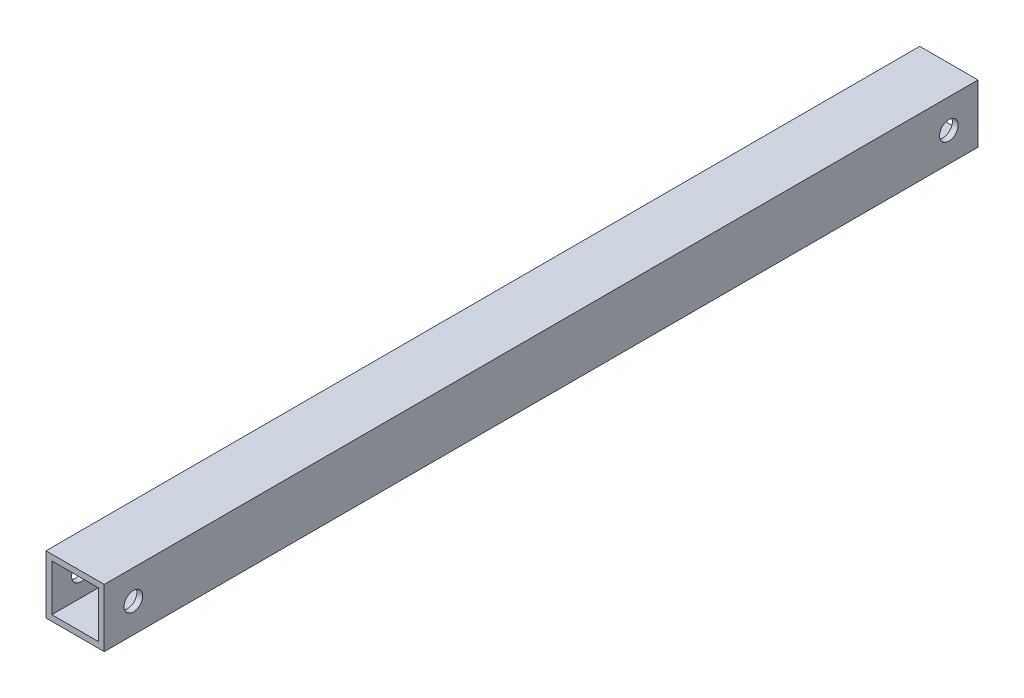
ISO-10303-21;
HEADER;
FILE_DESCRIPTION(('STEP AP214'),'2;1');
FILE_NAME('part.step','',(''),(''),'','','');
FILE_SCHEMA(('AUTOMOTIVE_DESIGN { 1 0 10303 214 1 1 1 1 }'));
ENDSEC;
DATA;
#1=APPLICATION_CONTEXT('core data for automotive mechanical design processes');
#2=APPLICATION_PROTOCOL_DEFINITION('international standard','automotive_design',2000,#1);
#3=PRODUCT_CONTEXT('',#1,'mechanical');
#4=PRODUCT('Part','Part','',(#3));
#5=PRODUCT_RELATED_PRODUCT_CATEGORY('part','',(#4));
#6=PRODUCT_DEFINITION_FORMATION('','',#4);
#7=PRODUCT_DEFINITION_CONTEXT('part definition',#1,'design');
#8=PRODUCT_DEFINITION('design','',#6,#7);
#9=PRODUCT_DEFINITION_SHAPE('','',#8);
#10=(LENGTH_UNIT() NAMED_UNIT(*) SI_UNIT(.MILLI.,.METRE.));
#11=(NAMED_UNIT(*) PLANE_ANGLE_UNIT() SI_UNIT($,.RADIAN.));
#12=(NAMED_UNIT(*) SI_UNIT($,.STERADIAN.) SOLID_ANGLE_UNIT());
#13=UNCERTAINTY_MEASURE_WITH_UNIT(LENGTH_MEASURE(1.E-05),#10,'distance_accuracy_value','');
#14=(GEOMETRIC_REPRESENTATION_CONTEXT(3) GLOBAL_UNCERTAINTY_ASSIGNED_CONTEXT((#13)) GLOBAL_UNIT_ASSIGNED_CONTEXT((#10,
#11,#12)) REPRESENTATION_CONTEXT('',''));
#15=CARTESIAN_POINT('',(0.,0.,0.));
#16=DIRECTION('',(0.,0.,1.));
#17=DIRECTION('',(1.,0.,0.));
#18=AXIS2_PLACEMENT_3D('',#15,#16,#17);
#19=CARTESIAN_POINT('',(0.,0.,150.));
#20=DIRECTION('',(0.,0.,1.));
#21=DIRECTION('',(1.,0.,0.));
#22=AXIS2_PLACEMENT_3D('',#19,#20,#21);
#23=PLANE('',#22);
#24=DIRECTION('',(0.,1.,0.));
#25=VECTOR('',#24,1.);
#26=CARTESIAN_POINT('',(5.,5.,150.));
#27=LINE('',#26,#25);
#28=CARTESIAN_POINT('',(5.,-5.,150.));
#29=VERTEX_POINT('',#28);
#30=CARTESIAN_POINT('',(5.,5.,150.));
#31=VERTEX_POINT('',#30);
#32=EDGE_CURVE('E140',#29,#31,#27,.T.);
#33=ORIENTED_EDGE('',*,*,#32,.T.);
#34=DIRECTION('',(-1.,0.,0.));
#35=VECTOR('',#34,1.);
#36=CARTESIAN_POINT('',(-5.,5.,150.));
#37=LINE('',#36,#35);
#38=CARTESIAN_POINT('',(-5.,5.,150.));
#39=VERTEX_POINT('',#38);
#40=EDGE_CURVE('E143',#31,#39,#37,.T.);
#41=ORIENTED_EDGE('',*,*,#40,.T.);
#42=DIRECTION('',(0.,-1.,0.));
#43=VECTOR('',#42,1.);
#44=CARTESIAN_POINT('',(-5.,5.,150.));
#45=LINE('',#44,#43);
#46=CARTESIAN_POINT('',(-5.,-5.,150.));
#47=VERTEX_POINT('',#46);
#48=EDGE_CURVE('E146',#39,#47,#45,.T.);
#49=ORIENTED_EDGE('',*,*,#48,.T.);
#50=DIRECTION('',(1.,0.,0.));
#51=VECTOR('',#50,1.);
#52=CARTESIAN_POINT('',(-5.,-5.,150.));
#53=LINE('',#52,#51);
#54=EDGE_CURVE('E148',#47,#29,#53,.T.);
#55=ORIENTED_EDGE('',*,*,#54,.T.);
#56=EDGE_LOOP('',(#33,#41,#49,#55));
#57=FACE_BOUND('',#56,.T.);
#58=DIRECTION('',(0.,-1.,0.));
#59=VECTOR('',#58,1.);
#60=CARTESIAN_POINT('',(-4.,4.,150.));
#61=LINE('',#60,#59);
#62=CARTESIAN_POINT('',(-4.,4.,150.));
#63=VERTEX_POINT('',#62);
#64=CARTESIAN_POINT('',(-4.,-4.,150.));
#65=VERTEX_POINT('',#64);
#66=EDGE_CURVE('E110',#63,#65,#61,.T.);
#67=ORIENTED_EDGE('',*,*,#66,.F.);
#68=DIRECTION('',(-1.,0.,0.));
#69=VECTOR('',#68,1.);
#70=CARTESIAN_POINT('',(-4.,4.,150.));
#71=LINE('',#70,#69);
#72=CARTESIAN_POINT('',(4.,4.,150.));
#73=VERTEX_POINT('',#72);
#74=EDGE_CURVE('E102',#73,#63,#71,.T.);
#75=ORIENTED_EDGE('',*,*,#74,.F.);
#76=DIRECTION('',(0.,1.,0.));
#77=VECTOR('',#76,1.);
#78=CARTESIAN_POINT('',(4.,4.,150.));
#79=LINE('',#78,#77);
#80=CARTESIAN_POINT('',(4.,-4.,150.));
#81=VERTEX_POINT('',#80);
#82=EDGE_CURVE('E124',#81,#73,#79,.T.);
#83=ORIENTED_EDGE('',*,*,#82,.F.);
#84=DIRECTION('',(1.,0.,0.));
#85=VECTOR('',#84,1.);
#86=CARTESIAN_POINT('',(-4.,-4.,150.));
#87=LINE('',#86,#85);
#88=EDGE_CURVE('E122',#65,#81,#87,.T.);
#89=ORIENTED_EDGE('',*,*,#88,.F.);
#90=EDGE_LOOP('',(#67,#75,#83,#89));
#91=FACE_BOUND('',#90,.T.);
#92=ADVANCED_FACE('F35',(#57,#91),#23,.T.);
#93=CARTESIAN_POINT('',(0.,0.,0.));
#94=DIRECTION('',(0.,0.,1.));
#95=DIRECTION('',(1.,0.,0.));
#96=AXIS2_PLACEMENT_3D('',#93,#94,#95);
#97=PLANE('',#96);
#98=DIRECTION('',(0.,1.,0.));
#99=VECTOR('',#98,1.);
#100=CARTESIAN_POINT('',(5.,5.,0.));
#101=LINE('',#100,#99);
#102=CARTESIAN_POINT('',(5.,-5.,0.));
#103=VERTEX_POINT('',#102);
#104=CARTESIAN_POINT('',(5.,5.,0.));
#105=VERTEX_POINT('',#104);
#106=EDGE_CURVE('E118',#103,#105,#101,.T.);
#107=ORIENTED_EDGE('',*,*,#106,.F.);
#108=DIRECTION('',(1.,0.,0.));
#109=VECTOR('',#108,1.);
#110=CARTESIAN_POINT('',(-5.,-5.,0.));
#111=LINE('',#110,#109);
#112=CARTESIAN_POINT('',(-5.,-5.,0.));
#113=VERTEX_POINT('',#112);
#114=EDGE_CURVE('E144',#113,#103,#111,.T.);
#115=ORIENTED_EDGE('',*,*,#114,.F.);
#116=DIRECTION('',(0.,-1.,0.));
#117=VECTOR('',#116,1.);
#118=CARTESIAN_POINT('',(-5.,5.,0.));
#119=LINE('',#118,#117);
#120=CARTESIAN_POINT('',(-5.,5.,0.));
#121=VERTEX_POINT('',#120);
#122=EDGE_CURVE('E155',#121,#113,#119,.T.);
#123=ORIENTED_EDGE('',*,*,#122,.F.);
#124=DIRECTION('',(-1.,0.,0.));
#125=VECTOR('',#124,1.);
#126=CARTESIAN_POINT('',(-5.,5.,0.));
#127=LINE('',#126,#125);
#128=EDGE_CURVE('E153',#105,#121,#127,.T.);
#129=ORIENTED_EDGE('',*,*,#128,.F.);
#130=EDGE_LOOP('',(#107,#115,#123,#129));
#131=FACE_BOUND('',#130,.T.);
#132=DIRECTION('',(-1.,0.,0.));
#133=VECTOR('',#132,1.);
#134=CARTESIAN_POINT('',(-4.,4.,0.));
#135=LINE('',#134,#133);
#136=CARTESIAN_POINT('',(4.,4.,0.));
#137=VERTEX_POINT('',#136);
#138=CARTESIAN_POINT('',(-4.,4.,0.));
#139=VERTEX_POINT('',#138);
#140=EDGE_CURVE('E60',#137,#139,#135,.T.);
#141=ORIENTED_EDGE('',*,*,#140,.T.);
#142=DIRECTION('',(0.,-1.,0.));
#143=VECTOR('',#142,1.);
#144=CARTESIAN_POINT('',(-4.,4.,0.));
#145=LINE('',#144,#143);
#146=CARTESIAN_POINT('',(-4.,-4.,0.));
#147=VERTEX_POINT('',#146);
#148=EDGE_CURVE('E117',#139,#147,#145,.T.);
#149=ORIENTED_EDGE('',*,*,#148,.T.);
#150=DIRECTION('',(1.,0.,0.));
#151=VECTOR('',#150,1.);
#152=CARTESIAN_POINT('',(-4.,-4.,0.));
#153=LINE('',#152,#151);
#154=CARTESIAN_POINT('',(4.,-4.,0.));
#155=VERTEX_POINT('',#154);
#156=EDGE_CURVE('E132',#147,#155,#153,.T.);
#157=ORIENTED_EDGE('',*,*,#156,.T.);
#158=DIRECTION('',(0.,1.,0.));
#159=VECTOR('',#158,1.);
#160=CARTESIAN_POINT('',(4.,4.,0.));
#161=LINE('',#160,#159);
#162=EDGE_CURVE('E111',#155,#137,#161,.T.);
#163=ORIENTED_EDGE('',*,*,#162,.T.);
#164=EDGE_LOOP('',(#141,#149,#157,#163));
#165=FACE_BOUND('',#164,.T.);
#166=ADVANCED_FACE('F202',(#131,#165),#97,.F.);
#167=CARTESIAN_POINT('',(5.,5.,150.));
#168=DIRECTION('',(-1.,0.,0.));
#169=DIRECTION('',(0.,-1.,0.));
#170=AXIS2_PLACEMENT_3D('',#167,#168,#169);
#171=PLANE('',#170);
#172=CARTESIAN_POINT('',(5.,0.,145.));
#173=DIRECTION('',(1.,0.,0.));
#174=DIRECTION('',(0.,1.,0.));
#175=AXIS2_PLACEMENT_3D('',#172,#173,#174);
#176=CIRCLE('',#175,1.59999999999999);
#177=CARTESIAN_POINT('',(5.,1.59999999999999,145.));
#178=VERTEX_POINT('',#177);
#179=EDGE_CURVE('E173',#178,#178,#176,.T.);
#180=ORIENTED_EDGE('',*,*,#179,.F.);
#181=EDGE_LOOP('',(#180));
#182=FACE_BOUND('',#181,.T.);
#183=CARTESIAN_POINT('',(5.,0.,5.));
#184=DIRECTION('',(1.,0.,0.));
#185=DIRECTION('',(0.,1.,0.));
#186=AXIS2_PLACEMENT_3D('',#183,#184,#185);
#187=CIRCLE('',#186,1.59999999999999);
#188=CARTESIAN_POINT('',(5.,1.59999999999999,5.));
#189=VERTEX_POINT('',#188);
#190=EDGE_CURVE('E183',#189,#189,#187,.T.);
#191=ORIENTED_EDGE('',*,*,#190,.F.);
#192=EDGE_LOOP('',(#191));
#193=FACE_BOUND('',#192,.T.);
#194=ORIENTED_EDGE('',*,*,#106,.T.);
#195=DIRECTION('',(0.,0.,-1.));
#196=VECTOR('',#195,1.);
#197=CARTESIAN_POINT('',(5.,5.,150.));
#198=LINE('',#197,#196);
#199=EDGE_CURVE('E11',#31,#105,#198,.T.);
#200=ORIENTED_EDGE('',*,*,#199,.F.);
#201=ORIENTED_EDGE('',*,*,#32,.F.);
#202=DIRECTION('',(0.,0.,-1.));
#203=VECTOR('',#202,1.);
#204=CARTESIAN_POINT('',(5.,-5.,150.));
#205=LINE('',#204,#203);
#206=EDGE_CURVE('E150',#29,#103,#205,.T.);
#207=ORIENTED_EDGE('',*,*,#206,.T.);
#208=EDGE_LOOP('',(#194,#200,#201,#207));
#209=FACE_BOUND('',#208,.T.);
#210=ADVANCED_FACE('F37',(#182,#193,#209),#171,.F.);
#211=CARTESIAN_POINT('',(-5.,5.,150.));
#212=DIRECTION('',(0.,-1.,0.));
#213=DIRECTION('',(0.,0.,-1.));
#214=AXIS2_PLACEMENT_3D('',#211,#212,#213);
#215=PLANE('',#214);
#216=ORIENTED_EDGE('',*,*,#128,.T.);
#217=DIRECTION('',(0.,0.,-1.));
#218=VECTOR('',#217,1.);
#219=CARTESIAN_POINT('',(-5.,5.,150.));
#220=LINE('',#219,#218);
#221=EDGE_CURVE('E44',#39,#121,#220,.T.);
#222=ORIENTED_EDGE('',*,*,#221,.F.);
#223=ORIENTED_EDGE('',*,*,#40,.F.);
#224=ORIENTED_EDGE('',*,*,#199,.T.);
#225=EDGE_LOOP('',(#216,#222,#223,#224));
#226=FACE_BOUND('',#225,.T.);
#227=ADVANCED_FACE('F227',(#226),#215,.F.);
#228=CARTESIAN_POINT('',(-5.,5.,150.));
#229=DIRECTION('',(1.,0.,0.));
#230=DIRECTION('',(0.,1.,0.));
#231=AXIS2_PLACEMENT_3D('',#228,#229,#230);
#232=PLANE('',#231);
#233=CARTESIAN_POINT('',(-5.00000000000001,0.,145.));
#234=DIRECTION('',(1.,0.,0.));
#235=DIRECTION('',(0.,1.,0.));
#236=AXIS2_PLACEMENT_3D('',#233,#234,#235);
#237=CIRCLE('',#236,1.59999999999999);
#238=CARTESIAN_POINT('',(-5.00000000000001,1.59999999999999,145.));
#239=VERTEX_POINT('',#238);
#240=EDGE_CURVE('E167',#239,#239,#237,.T.);
#241=ORIENTED_EDGE('',*,*,#240,.T.);
#242=EDGE_LOOP('',(#241));
#243=FACE_BOUND('',#242,.T.);
#244=CARTESIAN_POINT('',(-5.00000000000001,0.,5.));
#245=DIRECTION('',(1.,0.,0.));
#246=DIRECTION('',(0.,1.,0.));
#247=AXIS2_PLACEMENT_3D('',#244,#245,#246);
#248=CIRCLE('',#247,1.59999999999999);
#249=CARTESIAN_POINT('',(-5.00000000000001,1.59999999999999,5.));
#250=VERTEX_POINT('',#249);
#251=EDGE_CURVE('E178',#250,#250,#248,.T.);
#252=ORIENTED_EDGE('',*,*,#251,.T.);
#253=EDGE_LOOP('',(#252));
#254=FACE_BOUND('',#253,.T.);
#255=ORIENTED_EDGE('',*,*,#122,.T.);
#256=DIRECTION('',(0.,0.,-1.));
#257=VECTOR('',#256,1.);
#258=CARTESIAN_POINT('',(-5.,-5.,150.));
#259=LINE('',#258,#257);
#260=EDGE_CURVE('E160',#47,#113,#259,.T.);
#261=ORIENTED_EDGE('',*,*,#260,.F.);
#262=ORIENTED_EDGE('',*,*,#48,.F.);
#263=ORIENTED_EDGE('',*,*,#221,.T.);
#264=EDGE_LOOP('',(#255,#261,#262,#263));
#265=FACE_BOUND('',#264,.T.);
#266=ADVANCED_FACE('F224',(#243,#254,#265),#232,.F.);
#267=CARTESIAN_POINT('',(-5.,-5.,150.));
#268=DIRECTION('',(0.,1.,0.));
#269=DIRECTION('',(0.,0.,1.));
#270=AXIS2_PLACEMENT_3D('',#267,#268,#269);
#271=PLANE('',#270);
#272=ORIENTED_EDGE('',*,*,#114,.T.);
#273=ORIENTED_EDGE('',*,*,#206,.F.);
#274=ORIENTED_EDGE('',*,*,#54,.F.);
#275=ORIENTED_EDGE('',*,*,#260,.T.);
#276=EDGE_LOOP('',(#272,#273,#274,#275));
#277=FACE_BOUND('',#276,.T.);
#278=ADVANCED_FACE('F221',(#277),#271,.F.);
#279=CARTESIAN_POINT('',(-4.,4.,150.));
#280=DIRECTION('',(0.,-1.,0.));
#281=DIRECTION('',(0.,0.,-1.));
#282=AXIS2_PLACEMENT_3D('',#279,#280,#281);
#283=PLANE('',#282);
#284=ORIENTED_EDGE('',*,*,#140,.F.);
#285=DIRECTION('',(0.,0.,-1.));
#286=VECTOR('',#285,1.);
#287=CARTESIAN_POINT('',(4.,4.,150.));
#288=LINE('',#287,#286);
#289=EDGE_CURVE('E106',#73,#137,#288,.T.);
#290=ORIENTED_EDGE('',*,*,#289,.F.);
#291=ORIENTED_EDGE('',*,*,#74,.T.);
#292=DIRECTION('',(0.,0.,-1.));
#293=VECTOR('',#292,1.);
#294=CARTESIAN_POINT('',(-4.,4.,150.));
#295=LINE('',#294,#293);
#296=EDGE_CURVE('E105',#63,#139,#295,.T.);
#297=ORIENTED_EDGE('',*,*,#296,.T.);
#298=EDGE_LOOP('',(#284,#290,#291,#297));
#299=FACE_BOUND('',#298,.T.);
#300=ADVANCED_FACE('F104',(#299),#283,.T.);
#301=CARTESIAN_POINT('',(-4.,4.,150.));
#302=DIRECTION('',(1.,0.,0.));
#303=DIRECTION('',(0.,1.,0.));
#304=AXIS2_PLACEMENT_3D('',#301,#302,#303);
#305=PLANE('',#304);
#306=CARTESIAN_POINT('',(-4.,0.,145.));
#307=DIRECTION('',(1.,0.,0.));
#308=DIRECTION('',(0.,1.,0.));
#309=AXIS2_PLACEMENT_3D('',#306,#307,#308);
#310=CIRCLE('',#309,1.59999999999999);
#311=CARTESIAN_POINT('',(-4.,1.59999999999999,145.));
#312=VERTEX_POINT('',#311);
#313=EDGE_CURVE('E130',#312,#312,#310,.T.);
#314=ORIENTED_EDGE('',*,*,#313,.F.);
#315=EDGE_LOOP('',(#314));
#316=FACE_BOUND('',#315,.T.);
#317=CARTESIAN_POINT('',(-4.,0.,5.));
#318=DIRECTION('',(1.,0.,0.));
#319=DIRECTION('',(0.,1.,0.));
#320=AXIS2_PLACEMENT_3D('',#317,#318,#319);
#321=CIRCLE('',#320,1.59999999999999);
#322=CARTESIAN_POINT('',(-4.,1.59999999999999,5.));
#323=VERTEX_POINT('',#322);
#324=EDGE_CURVE('E166',#323,#323,#321,.T.);
#325=ORIENTED_EDGE('',*,*,#324,.F.);
#326=EDGE_LOOP('',(#325));
#327=FACE_BOUND('',#326,.T.);
#328=ORIENTED_EDGE('',*,*,#148,.F.);
#329=ORIENTED_EDGE('',*,*,#296,.F.);
#330=ORIENTED_EDGE('',*,*,#66,.T.);
#331=DIRECTION('',(0.,0.,-1.));
#332=VECTOR('',#331,1.);
#333=CARTESIAN_POINT('',(-4.,-4.,150.));
#334=LINE('',#333,#332);
#335=EDGE_CURVE('E119',#65,#147,#334,.T.);
#336=ORIENTED_EDGE('',*,*,#335,.T.);
#337=EDGE_LOOP('',(#328,#329,#330,#336));
#338=FACE_BOUND('',#337,.T.);
#339=ADVANCED_FACE('F114',(#316,#327,#338),#305,.T.);
#340=CARTESIAN_POINT('',(-4.,-4.,150.));
#341=DIRECTION('',(0.,1.,0.));
#342=DIRECTION('',(0.,0.,1.));
#343=AXIS2_PLACEMENT_3D('',#340,#341,#342);
#344=PLANE('',#343);
#345=ORIENTED_EDGE('',*,*,#156,.F.);
#346=ORIENTED_EDGE('',*,*,#335,.F.);
#347=ORIENTED_EDGE('',*,*,#88,.T.);
#348=DIRECTION('',(0.,0.,-1.));
#349=VECTOR('',#348,1.);
#350=CARTESIAN_POINT('',(4.,-4.,150.));
#351=LINE('',#350,#349);
#352=EDGE_CURVE('E52',#81,#155,#351,.T.);
#353=ORIENTED_EDGE('',*,*,#352,.T.);
#354=EDGE_LOOP('',(#345,#346,#347,#353));
#355=FACE_BOUND('',#354,.T.);
#356=ADVANCED_FACE('F198',(#355),#344,.T.);
#357=CARTESIAN_POINT('',(4.,4.,150.));
#358=DIRECTION('',(-1.,0.,0.));
#359=DIRECTION('',(0.,-1.,0.));
#360=AXIS2_PLACEMENT_3D('',#357,#358,#359);
#361=PLANE('',#360);
#362=CARTESIAN_POINT('',(4.,0.,145.));
#363=DIRECTION('',(-1.,0.,0.));
#364=DIRECTION('',(0.,-1.,0.));
#365=AXIS2_PLACEMENT_3D('',#362,#363,#364);
#366=CIRCLE('',#365,1.59999999999999);
#367=CARTESIAN_POINT('',(4.,1.59999999999999,145.));
#368=VERTEX_POINT('',#367);
#369=EDGE_CURVE('E39',#368,#368,#366,.T.);
#370=ORIENTED_EDGE('',*,*,#369,.F.);
#371=EDGE_LOOP('',(#370));
#372=FACE_BOUND('',#371,.T.);
#373=CARTESIAN_POINT('',(4.,0.,5.));
#374=DIRECTION('',(-1.,0.,0.));
#375=DIRECTION('',(0.,-1.,0.));
#376=AXIS2_PLACEMENT_3D('',#373,#374,#375);
#377=CIRCLE('',#376,1.59999999999999);
#378=CARTESIAN_POINT('',(4.,1.59999999999999,5.));
#379=VERTEX_POINT('',#378);
#380=EDGE_CURVE('E164',#379,#379,#377,.T.);
#381=ORIENTED_EDGE('',*,*,#380,.F.);
#382=EDGE_LOOP('',(#381));
#383=FACE_BOUND('',#382,.T.);
#384=ORIENTED_EDGE('',*,*,#162,.F.);
#385=ORIENTED_EDGE('',*,*,#352,.F.);
#386=ORIENTED_EDGE('',*,*,#82,.T.);
#387=ORIENTED_EDGE('',*,*,#289,.T.);
#388=EDGE_LOOP('',(#384,#385,#386,#387));
#389=FACE_BOUND('',#388,.T.);
#390=ADVANCED_FACE('F194',(#372,#383,#389),#361,.T.);
#391=CARTESIAN_POINT('',(-5.00000000000001,0.,5.));
#392=DIRECTION('',(1.,0.,0.));
#393=DIRECTION('',(0.,1.,0.));
#394=AXIS2_PLACEMENT_3D('',#391,#392,#393);
#395=CYLINDRICAL_SURFACE('',#394,1.59999999999999);
#396=CARTESIAN_POINT('',(4.,1.59999999999999,5.));
#397=CARTESIAN_POINT('',(4.01041666666666,1.59999999999999,5.));
#398=CARTESIAN_POINT('',(4.02083333333333,1.59999999999999,5.));
#399=CARTESIAN_POINT('',(4.04166666666666,1.59999999999999,5.));
#400=CARTESIAN_POINT('',(4.05208333333333,1.59999999999999,5.));
#401=CARTESIAN_POINT('',(4.07291666666666,1.59999999999999,5.));
#402=CARTESIAN_POINT('',(4.08333333333333,1.59999999999999,5.));
#403=CARTESIAN_POINT('',(4.10416666666666,1.59999999999999,5.));
#404=CARTESIAN_POINT('',(4.11458333333333,1.59999999999999,5.));
#405=CARTESIAN_POINT('',(4.13541666666666,1.59999999999999,5.));
#406=CARTESIAN_POINT('',(4.14583333333333,1.59999999999999,5.));
#407=CARTESIAN_POINT('',(4.16666666666666,1.59999999999999,5.));
#408=CARTESIAN_POINT('',(4.17708333333333,1.59999999999999,5.));
#409=CARTESIAN_POINT('',(4.19791666666666,1.59999999999999,5.));
#410=CARTESIAN_POINT('',(4.20833333333333,1.59999999999999,5.));
#411=CARTESIAN_POINT('',(4.22916666666666,1.59999999999999,5.));
#412=CARTESIAN_POINT('',(4.23958333333333,1.59999999999999,5.));
#413=CARTESIAN_POINT('',(4.26041666666666,1.59999999999999,5.));
#414=CARTESIAN_POINT('',(4.27083333333333,1.59999999999999,5.));
#415=CARTESIAN_POINT('',(4.29166666666666,1.59999999999999,5.));
#416=CARTESIAN_POINT('',(4.30208333333333,1.59999999999999,5.));
#417=CARTESIAN_POINT('',(4.32291666666666,1.59999999999999,5.));
#418=CARTESIAN_POINT('',(4.33333333333333,1.59999999999999,5.));
#419=CARTESIAN_POINT('',(4.35416666666666,1.59999999999999,5.));
#420=CARTESIAN_POINT('',(4.36458333333333,1.59999999999999,5.));
#421=CARTESIAN_POINT('',(4.38541666666666,1.59999999999999,5.));
#422=CARTESIAN_POINT('',(4.39583333333333,1.59999999999999,5.));
#423=CARTESIAN_POINT('',(4.41666666666666,1.59999999999999,5.));
#424=CARTESIAN_POINT('',(4.42708333333333,1.59999999999999,5.));
#425=CARTESIAN_POINT('',(4.44791666666666,1.59999999999999,5.));
#426=CARTESIAN_POINT('',(4.45833333333333,1.59999999999999,5.));
#427=CARTESIAN_POINT('',(4.47916666666666,1.59999999999999,5.));
#428=CARTESIAN_POINT('',(4.48958333333333,1.59999999999999,5.));
#429=CARTESIAN_POINT('',(4.51041666666666,1.59999999999999,5.));
#430=CARTESIAN_POINT('',(4.52083333333333,1.59999999999999,5.));
#431=CARTESIAN_POINT('',(4.54166666666666,1.59999999999999,5.));
#432=CARTESIAN_POINT('',(4.55208333333333,1.59999999999999,5.));
#433=CARTESIAN_POINT('',(4.57291666666666,1.59999999999999,5.));
#434=CARTESIAN_POINT('',(4.58333333333333,1.59999999999999,5.));
#435=CARTESIAN_POINT('',(4.60416666666666,1.59999999999999,5.));
#436=CARTESIAN_POINT('',(4.61458333333333,1.59999999999999,5.));
#437=CARTESIAN_POINT('',(4.63541666666666,1.59999999999999,5.));
#438=CARTESIAN_POINT('',(4.64583333333333,1.59999999999999,5.));
#439=CARTESIAN_POINT('',(4.66666666666666,1.59999999999999,5.));
#440=CARTESIAN_POINT('',(4.67708333333333,1.59999999999999,5.));
#441=CARTESIAN_POINT('',(4.69791666666666,1.59999999999999,5.));
#442=CARTESIAN_POINT('',(4.70833333333333,1.59999999999999,5.));
#443=CARTESIAN_POINT('',(4.72916666666666,1.59999999999999,5.));
#444=CARTESIAN_POINT('',(4.73958333333333,1.59999999999999,5.));
#445=CARTESIAN_POINT('',(4.76041666666666,1.59999999999999,5.));
#446=CARTESIAN_POINT('',(4.77083333333333,1.59999999999999,5.));
#447=CARTESIAN_POINT('',(4.79166666666666,1.59999999999999,5.));
#448=CARTESIAN_POINT('',(4.80208333333333,1.59999999999999,5.));
#449=CARTESIAN_POINT('',(4.82291666666666,1.59999999999999,5.));
#450=CARTESIAN_POINT('',(4.83333333333333,1.59999999999999,5.));
#451=CARTESIAN_POINT('',(4.85416666666666,1.59999999999999,5.));
#452=CARTESIAN_POINT('',(4.86458333333333,1.59999999999999,5.));
#453=CARTESIAN_POINT('',(4.88541666666666,1.59999999999999,5.));
#454=CARTESIAN_POINT('',(4.89583333333333,1.59999999999999,5.));
#455=CARTESIAN_POINT('',(4.91666666666666,1.59999999999999,5.));
#456=CARTESIAN_POINT('',(4.92708333333333,1.59999999999999,5.));
#457=CARTESIAN_POINT('',(4.94791666666666,1.59999999999999,5.));
#458=CARTESIAN_POINT('',(4.95833333333333,1.59999999999999,5.));
#459=CARTESIAN_POINT('',(4.97916666666666,1.59999999999999,5.));
#460=CARTESIAN_POINT('',(4.98958333333333,1.59999999999999,5.));
#461=CARTESIAN_POINT('',(5.,1.59999999999999,5.));
#462=B_SPLINE_CURVE_WITH_KNOTS('',3,(#396,#397,#398,#399,#400,#401,#402,#403,#404,#405,#406,
#407,#408,#409,#410,#411,#412,#413,#414,#415,#416,#417,#418,#419,#420,#421,#422,#423,#424,#425,
#426,#427,#428,#429,#430,#431,#432,#433,#434,#435,#436,#437,#438,#439,#440,#441,#442,#443,#444,
#445,#446,#447,#448,#449,#450,#451,#452,#453,#454,#455,#456,#457,#458,#459,#460,#461),
.UNSPECIFIED.,.F.,.F.,(4,2,2,2,2,2,2,2,2,2,2,2,2,2,2,2,2,2,2,2,2,2,2,2,2,2,2,2,2,2,2,2,4),(0.,
0.03125,0.0625000000000001,0.0937500000000001,0.125,0.15625,0.1875,0.21875,0.25,0.28125,0.3125,
0.34375,0.375,0.40625,0.4375,0.46875,0.5,0.53125,0.5625,0.593750000000001,0.625000000000001,
0.656250000000001,0.687500000000001,0.718750000000001,0.750000000000001,0.781250000000001,
0.812500000000001,0.843750000000001,0.875000000000001,0.906250000000001,0.937500000000001,
0.968750000000001,1.),.UNSPECIFIED.);
#463=EDGE_CURVE('BSEAM197',#379,#189,#462,.T.);
#464=ORIENTED_EDGE('',*,*,#380,.T.);
#465=ORIENTED_EDGE('',*,*,#190,.T.);
#466=ORIENTED_EDGE('',*,*,#463,.T.);
#467=ORIENTED_EDGE('',*,*,#463,.F.);
#468=EDGE_LOOP('',(#464,#466,#465,#467));
#469=FACE_BOUND('',#468,.T.);
#470=ADVANCED_FACE('F197',(#469),#395,.F.);
#471=CARTESIAN_POINT('',(-5.00000000000001,0.,145.));
#472=DIRECTION('',(1.,0.,0.));
#473=DIRECTION('',(0.,1.,0.));
#474=AXIS2_PLACEMENT_3D('',#471,#472,#473);
#475=CYLINDRICAL_SURFACE('',#474,1.59999999999999);
#476=CARTESIAN_POINT('',(4.,1.59999999999999,145.));
#477=CARTESIAN_POINT('',(4.01041666666666,1.59999999999999,145.));
#478=CARTESIAN_POINT('',(4.02083333333333,1.59999999999999,145.));
#479=CARTESIAN_POINT('',(4.04166666666666,1.59999999999999,145.));
#480=CARTESIAN_POINT('',(4.05208333333333,1.59999999999999,145.));
#481=CARTESIAN_POINT('',(4.07291666666666,1.59999999999999,145.));
#482=CARTESIAN_POINT('',(4.08333333333333,1.59999999999999,145.));
#483=CARTESIAN_POINT('',(4.10416666666666,1.59999999999999,145.));
#484=CARTESIAN_POINT('',(4.11458333333333,1.59999999999999,145.));
#485=CARTESIAN_POINT('',(4.13541666666666,1.59999999999999,145.));
#486=CARTESIAN_POINT('',(4.14583333333333,1.59999999999999,145.));
#487=CARTESIAN_POINT('',(4.16666666666666,1.59999999999999,145.));
#488=CARTESIAN_POINT('',(4.17708333333333,1.59999999999999,145.));
#489=CARTESIAN_POINT('',(4.19791666666666,1.59999999999999,145.));
#490=CARTESIAN_POINT('',(4.20833333333333,1.59999999999999,145.));
#491=CARTESIAN_POINT('',(4.22916666666666,1.59999999999999,145.));
#492=CARTESIAN_POINT('',(4.23958333333333,1.59999999999999,145.));
#493=CARTESIAN_POINT('',(4.26041666666666,1.59999999999999,145.));
#494=CARTESIAN_POINT('',(4.27083333333333,1.59999999999999,145.));
#495=CARTESIAN_POINT('',(4.29166666666666,1.59999999999999,145.));
#496=CARTESIAN_POINT('',(4.30208333333333,1.59999999999999,145.));
#497=CARTESIAN_POINT('',(4.32291666666666,1.59999999999999,145.));
#498=CARTESIAN_POINT('',(4.33333333333333,1.59999999999999,145.));
#499=CARTESIAN_POINT('',(4.35416666666666,1.59999999999999,145.));
#500=CARTESIAN_POINT('',(4.36458333333333,1.59999999999999,145.));
#501=CARTESIAN_POINT('',(4.38541666666666,1.59999999999999,145.));
#502=CARTESIAN_POINT('',(4.39583333333333,1.59999999999999,145.));
#503=CARTESIAN_POINT('',(4.41666666666666,1.59999999999999,145.));
#504=CARTESIAN_POINT('',(4.42708333333333,1.59999999999999,145.));
#505=CARTESIAN_POINT('',(4.44791666666666,1.59999999999999,145.));
#506=CARTESIAN_POINT('',(4.45833333333333,1.59999999999999,145.));
#507=CARTESIAN_POINT('',(4.47916666666666,1.59999999999999,145.));
#508=CARTESIAN_POINT('',(4.48958333333333,1.59999999999999,145.));
#509=CARTESIAN_POINT('',(4.51041666666666,1.59999999999999,145.));
#510=CARTESIAN_POINT('',(4.52083333333333,1.59999999999999,145.));
#511=CARTESIAN_POINT('',(4.54166666666666,1.59999999999999,145.));
#512=CARTESIAN_POINT('',(4.55208333333333,1.59999999999999,145.));
#513=CARTESIAN_POINT('',(4.57291666666666,1.59999999999999,145.));
#514=CARTESIAN_POINT('',(4.58333333333333,1.59999999999999,145.));
#515=CARTESIAN_POINT('',(4.60416666666666,1.59999999999999,145.));
#516=CARTESIAN_POINT('',(4.61458333333333,1.59999999999999,145.));
#517=CARTESIAN_POINT('',(4.63541666666666,1.59999999999999,145.));
#518=CARTESIAN_POINT('',(4.64583333333333,1.59999999999999,145.));
#519=CARTESIAN_POINT('',(4.66666666666666,1.59999999999999,145.));
#520=CARTESIAN_POINT('',(4.67708333333333,1.59999999999999,145.));
#521=CARTESIAN_POINT('',(4.69791666666666,1.59999999999999,145.));
#522=CARTESIAN_POINT('',(4.70833333333333,1.59999999999999,145.));
#523=CARTESIAN_POINT('',(4.72916666666666,1.59999999999999,145.));
#524=CARTESIAN_POINT('',(4.73958333333333,1.59999999999999,145.));
#525=CARTESIAN_POINT('',(4.76041666666666,1.59999999999999,145.));
#526=CARTESIAN_POINT('',(4.77083333333333,1.59999999999999,145.));
#527=CARTESIAN_POINT('',(4.79166666666666,1.59999999999999,145.));
#528=CARTESIAN_POINT('',(4.80208333333333,1.59999999999999,145.));
#529=CARTESIAN_POINT('',(4.82291666666666,1.59999999999999,145.));
#530=CARTESIAN_POINT('',(4.83333333333333,1.59999999999999,145.));
#531=CARTESIAN_POINT('',(4.85416666666666,1.59999999999999,145.));
#532=CARTESIAN_POINT('',(4.86458333333333,1.59999999999999,145.));
#533=CARTESIAN_POINT('',(4.88541666666666,1.59999999999999,145.));
#534=CARTESIAN_POINT('',(4.89583333333333,1.59999999999999,145.));
#535=CARTESIAN_POINT('',(4.91666666666666,1.59999999999999,145.));
#536=CARTESIAN_POINT('',(4.92708333333333,1.59999999999999,145.));
#537=CARTESIAN_POINT('',(4.94791666666666,1.59999999999999,145.));
#538=CARTESIAN_POINT('',(4.95833333333333,1.59999999999999,145.));
#539=CARTESIAN_POINT('',(4.97916666666666,1.59999999999999,145.));
#540=CARTESIAN_POINT('',(4.98958333333333,1.59999999999999,145.));
#541=CARTESIAN_POINT('',(5.,1.59999999999999,145.));
#542=B_SPLINE_CURVE_WITH_KNOTS('',3,(#476,#477,#478,#479,#480,#481,#482,#483,#484,#485,#486,
#487,#488,#489,#490,#491,#492,#493,#494,#495,#496,#497,#498,#499,#500,#501,#502,#503,#504,#505,
#506,#507,#508,#509,#510,#511,#512,#513,#514,#515,#516,#517,#518,#519,#520,#521,#522,#523,#524,
#525,#526,#527,#528,#529,#530,#531,#532,#533,#534,#535,#536,#537,#538,#539,#540,#541),
.UNSPECIFIED.,.F.,.F.,(4,2,2,2,2,2,2,2,2,2,2,2,2,2,2,2,2,2,2,2,2,2,2,2,2,2,2,2,2,2,2,2,4),(0.,
0.03125,0.0625000000000001,0.0937500000000001,0.125,0.15625,0.1875,0.21875,0.25,0.28125,0.3125,
0.34375,0.375,0.40625,0.4375,0.46875,0.5,0.53125,0.5625,0.593750000000001,0.625000000000001,
0.656250000000001,0.687500000000001,0.718750000000001,0.750000000000001,0.781250000000001,
0.812500000000001,0.843750000000001,0.875000000000001,0.906250000000001,0.937500000000001,
0.968750000000001,1.),.UNSPECIFIED.);
#543=EDGE_CURVE('BSEAM191',#368,#178,#542,.T.);
#544=ORIENTED_EDGE('',*,*,#369,.T.);
#545=ORIENTED_EDGE('',*,*,#179,.T.);
#546=ORIENTED_EDGE('',*,*,#543,.T.);
#547=ORIENTED_EDGE('',*,*,#543,.F.);
#548=EDGE_LOOP('',(#544,#546,#545,#547));
#549=FACE_BOUND('',#548,.T.);
#550=ADVANCED_FACE('F191',(#549),#475,.F.);
#551=CARTESIAN_POINT('',(-4.,1.59999999999999,5.));
#552=CARTESIAN_POINT('',(-4.01041666666667,1.59999999999999,5.));
#553=CARTESIAN_POINT('',(-4.02083333333334,1.59999999999999,5.));
#554=CARTESIAN_POINT('',(-4.04166666666667,1.59999999999999,5.));
#555=CARTESIAN_POINT('',(-4.05208333333334,1.59999999999999,5.));
#556=CARTESIAN_POINT('',(-4.07291666666667,1.59999999999999,5.));
#557=CARTESIAN_POINT('',(-4.08333333333334,1.59999999999999,5.));
#558=CARTESIAN_POINT('',(-4.10416666666667,1.59999999999999,5.));
#559=CARTESIAN_POINT('',(-4.11458333333334,1.59999999999999,5.));
#560=CARTESIAN_POINT('',(-4.13541666666667,1.59999999999999,5.));
#561=CARTESIAN_POINT('',(-4.14583333333334,1.59999999999999,5.));
#562=CARTESIAN_POINT('',(-4.16666666666667,1.59999999999999,5.));
#563=CARTESIAN_POINT('',(-4.17708333333334,1.59999999999999,5.));
#564=CARTESIAN_POINT('',(-4.19791666666667,1.59999999999999,5.));
#565=CARTESIAN_POINT('',(-4.20833333333334,1.59999999999999,5.));
#566=CARTESIAN_POINT('',(-4.22916666666667,1.59999999999999,5.));
#567=CARTESIAN_POINT('',(-4.23958333333334,1.59999999999999,5.));
#568=CARTESIAN_POINT('',(-4.26041666666667,1.59999999999999,5.));
#569=CARTESIAN_POINT('',(-4.27083333333334,1.59999999999999,5.));
#570=CARTESIAN_POINT('',(-4.29166666666667,1.59999999999999,5.));
#571=CARTESIAN_POINT('',(-4.30208333333334,1.59999999999999,5.));
#572=CARTESIAN_POINT('',(-4.32291666666667,1.59999999999999,5.));
#573=CARTESIAN_POINT('',(-4.33333333333334,1.59999999999999,5.));
#574=CARTESIAN_POINT('',(-4.35416666666667,1.59999999999999,5.));
#575=CARTESIAN_POINT('',(-4.36458333333334,1.59999999999999,5.));
#576=CARTESIAN_POINT('',(-4.38541666666667,1.59999999999999,5.));
#577=CARTESIAN_POINT('',(-4.39583333333334,1.59999999999999,5.));
#578=CARTESIAN_POINT('',(-4.41666666666667,1.59999999999999,5.));
#579=CARTESIAN_POINT('',(-4.42708333333334,1.59999999999999,5.));
#580=CARTESIAN_POINT('',(-4.44791666666667,1.59999999999999,5.));
#581=CARTESIAN_POINT('',(-4.45833333333334,1.59999999999999,5.));
#582=CARTESIAN_POINT('',(-4.47916666666667,1.59999999999999,5.));
#583=CARTESIAN_POINT('',(-4.48958333333334,1.59999999999999,5.));
#584=CARTESIAN_POINT('',(-4.51041666666667,1.59999999999999,5.));
#585=CARTESIAN_POINT('',(-4.52083333333334,1.59999999999999,5.));
#586=CARTESIAN_POINT('',(-4.54166666666667,1.59999999999999,5.));
#587=CARTESIAN_POINT('',(-4.55208333333334,1.59999999999999,5.));
#588=CARTESIAN_POINT('',(-4.57291666666667,1.59999999999999,5.));
#589=CARTESIAN_POINT('',(-4.58333333333334,1.59999999999999,5.));
#590=CARTESIAN_POINT('',(-4.60416666666667,1.59999999999999,5.));
#591=CARTESIAN_POINT('',(-4.61458333333334,1.59999999999999,5.));
#592=CARTESIAN_POINT('',(-4.63541666666667,1.59999999999999,5.));
#593=CARTESIAN_POINT('',(-4.64583333333334,1.59999999999999,5.));
#594=CARTESIAN_POINT('',(-4.66666666666667,1.59999999999999,5.));
#595=CARTESIAN_POINT('',(-4.67708333333334,1.59999999999999,5.));
#596=CARTESIAN_POINT('',(-4.69791666666667,1.59999999999999,5.));
#597=CARTESIAN_POINT('',(-4.70833333333334,1.59999999999999,5.));
#598=CARTESIAN_POINT('',(-4.72916666666667,1.59999999999999,5.));
#599=CARTESIAN_POINT('',(-4.73958333333334,1.59999999999999,5.));
#600=CARTESIAN_POINT('',(-4.76041666666667,1.59999999999999,5.));
#601=CARTESIAN_POINT('',(-4.77083333333334,1.59999999999999,5.));
#602=CARTESIAN_POINT('',(-4.79166666666667,1.59999999999999,5.));
#603=CARTESIAN_POINT('',(-4.80208333333334,1.59999999999999,5.));
#604=CARTESIAN_POINT('',(-4.82291666666667,1.59999999999999,5.));
#605=CARTESIAN_POINT('',(-4.83333333333334,1.59999999999999,5.));
#606=CARTESIAN_POINT('',(-4.85416666666667,1.59999999999999,5.));
#607=CARTESIAN_POINT('',(-4.86458333333334,1.59999999999999,5.));
#608=CARTESIAN_POINT('',(-4.88541666666667,1.59999999999999,5.));
#609=CARTESIAN_POINT('',(-4.89583333333334,1.59999999999999,5.));
#610=CARTESIAN_POINT('',(-4.91666666666667,1.59999999999999,5.));
#611=CARTESIAN_POINT('',(-4.92708333333334,1.59999999999999,5.));
#612=CARTESIAN_POINT('',(-4.94791666666667,1.59999999999999,5.));
#613=CARTESIAN_POINT('',(-4.95833333333334,1.59999999999999,5.));
#614=CARTESIAN_POINT('',(-4.97916666666667,1.59999999999999,5.));
#615=CARTESIAN_POINT('',(-4.98958333333334,1.59999999999999,5.));
#616=CARTESIAN_POINT('',(-5.00000000000001,1.59999999999999,5.));
#617=B_SPLINE_CURVE_WITH_KNOTS('',3,(#551,#552,#553,#554,#555,#556,#557,#558,#559,#560,#561,
#562,#563,#564,#565,#566,#567,#568,#569,#570,#571,#572,#573,#574,#575,#576,#577,#578,#579,#580,
#581,#582,#583,#584,#585,#586,#587,#588,#589,#590,#591,#592,#593,#594,#595,#596,#597,#598,#599,
#600,#601,#602,#603,#604,#605,#606,#607,#608,#609,#610,#611,#612,#613,#614,#615,#616),
.UNSPECIFIED.,.F.,.F.,(4,2,2,2,2,2,2,2,2,2,2,2,2,2,2,2,2,2,2,2,2,2,2,2,2,2,2,2,2,2,2,2,4),(0.,
0.03125,0.0625000000000001,0.0937500000000001,0.125,0.15625,0.1875,0.21875,0.25,
0.281250000000001,0.312500000000001,0.343750000000001,0.375000000000001,0.406250000000001,
0.437500000000001,0.468750000000001,0.500000000000001,0.531250000000001,0.562500000000001,
0.593750000000001,0.625000000000001,0.656250000000002,0.687500000000002,0.718750000000002,
0.750000000000002,0.781250000000002,0.812500000000002,0.843750000000002,0.875000000000003,
0.906250000000003,0.937500000000003,0.968750000000003,1.),.UNSPECIFIED.);
#618=EDGE_CURVE('BSEAM254',#323,#250,#617,.T.);
#619=ORIENTED_EDGE('',*,*,#324,.T.);
#620=ORIENTED_EDGE('',*,*,#251,.F.);
#621=ORIENTED_EDGE('',*,*,#618,.T.);
#622=ORIENTED_EDGE('',*,*,#618,.F.);
#623=EDGE_LOOP('',(#619,#621,#620,#622));
#624=FACE_BOUND('',#623,.T.);
#625=ADVANCED_FACE('F254',(#624),#395,.F.);
#626=CARTESIAN_POINT('',(-4.,1.59999999999999,145.));
#627=CARTESIAN_POINT('',(-4.01041666666667,1.59999999999999,145.));
#628=CARTESIAN_POINT('',(-4.02083333333334,1.59999999999999,145.));
#629=CARTESIAN_POINT('',(-4.04166666666667,1.59999999999999,145.));
#630=CARTESIAN_POINT('',(-4.05208333333334,1.59999999999999,145.));
#631=CARTESIAN_POINT('',(-4.07291666666667,1.59999999999999,145.));
#632=CARTESIAN_POINT('',(-4.08333333333334,1.59999999999999,145.));
#633=CARTESIAN_POINT('',(-4.10416666666667,1.59999999999999,145.));
#634=CARTESIAN_POINT('',(-4.11458333333334,1.59999999999999,145.));
#635=CARTESIAN_POINT('',(-4.13541666666667,1.59999999999999,145.));
#636=CARTESIAN_POINT('',(-4.14583333333334,1.59999999999999,145.));
#637=CARTESIAN_POINT('',(-4.16666666666667,1.59999999999999,145.));
#638=CARTESIAN_POINT('',(-4.17708333333334,1.59999999999999,145.));
#639=CARTESIAN_POINT('',(-4.19791666666667,1.59999999999999,145.));
#640=CARTESIAN_POINT('',(-4.20833333333334,1.59999999999999,145.));
#641=CARTESIAN_POINT('',(-4.22916666666667,1.59999999999999,145.));
#642=CARTESIAN_POINT('',(-4.23958333333334,1.59999999999999,145.));
#643=CARTESIAN_POINT('',(-4.26041666666667,1.59999999999999,145.));
#644=CARTESIAN_POINT('',(-4.27083333333334,1.59999999999999,145.));
#645=CARTESIAN_POINT('',(-4.29166666666667,1.59999999999999,145.));
#646=CARTESIAN_POINT('',(-4.30208333333334,1.59999999999999,145.));
#647=CARTESIAN_POINT('',(-4.32291666666667,1.59999999999999,145.));
#648=CARTESIAN_POINT('',(-4.33333333333334,1.59999999999999,145.));
#649=CARTESIAN_POINT('',(-4.35416666666667,1.59999999999999,145.));
#650=CARTESIAN_POINT('',(-4.36458333333334,1.59999999999999,145.));
#651=CARTESIAN_POINT('',(-4.38541666666667,1.59999999999999,145.));
#652=CARTESIAN_POINT('',(-4.39583333333334,1.59999999999999,145.));
#653=CARTESIAN_POINT('',(-4.41666666666667,1.59999999999999,145.));
#654=CARTESIAN_POINT('',(-4.42708333333334,1.59999999999999,145.));
#655=CARTESIAN_POINT('',(-4.44791666666667,1.59999999999999,145.));
#656=CARTESIAN_POINT('',(-4.45833333333334,1.59999999999999,145.));
#657=CARTESIAN_POINT('',(-4.47916666666667,1.59999999999999,145.));
#658=CARTESIAN_POINT('',(-4.48958333333334,1.59999999999999,145.));
#659=CARTESIAN_POINT('',(-4.51041666666667,1.59999999999999,145.));
#660=CARTESIAN_POINT('',(-4.52083333333334,1.59999999999999,145.));
#661=CARTESIAN_POINT('',(-4.54166666666667,1.59999999999999,145.));
#662=CARTESIAN_POINT('',(-4.55208333333334,1.59999999999999,145.));
#663=CARTESIAN_POINT('',(-4.57291666666667,1.59999999999999,145.));
#664=CARTESIAN_POINT('',(-4.58333333333334,1.59999999999999,145.));
#665=CARTESIAN_POINT('',(-4.60416666666667,1.59999999999999,145.));
#666=CARTESIAN_POINT('',(-4.61458333333334,1.59999999999999,145.));
#667=CARTESIAN_POINT('',(-4.63541666666667,1.59999999999999,145.));
#668=CARTESIAN_POINT('',(-4.64583333333334,1.59999999999999,145.));
#669=CARTESIAN_POINT('',(-4.66666666666667,1.59999999999999,145.));
#670=CARTESIAN_POINT('',(-4.67708333333334,1.59999999999999,145.));
#671=CARTESIAN_POINT('',(-4.69791666666667,1.59999999999999,145.));
#672=CARTESIAN_POINT('',(-4.70833333333334,1.59999999999999,145.));
#673=CARTESIAN_POINT('',(-4.72916666666667,1.59999999999999,145.));
#674=CARTESIAN_POINT('',(-4.73958333333334,1.59999999999999,145.));
#675=CARTESIAN_POINT('',(-4.76041666666667,1.59999999999999,145.));
#676=CARTESIAN_POINT('',(-4.77083333333334,1.59999999999999,145.));
#677=CARTESIAN_POINT('',(-4.79166666666667,1.59999999999999,145.));
#678=CARTESIAN_POINT('',(-4.80208333333334,1.59999999999999,145.));
#679=CARTESIAN_POINT('',(-4.82291666666667,1.59999999999999,145.));
#680=CARTESIAN_POINT('',(-4.83333333333334,1.59999999999999,145.));
#681=CARTESIAN_POINT('',(-4.85416666666667,1.59999999999999,145.));
#682=CARTESIAN_POINT('',(-4.86458333333334,1.59999999999999,145.));
#683=CARTESIAN_POINT('',(-4.88541666666667,1.59999999999999,145.));
#684=CARTESIAN_POINT('',(-4.89583333333334,1.59999999999999,145.));
#685=CARTESIAN_POINT('',(-4.91666666666667,1.59999999999999,145.));
#686=CARTESIAN_POINT('',(-4.92708333333334,1.59999999999999,145.));
#687=CARTESIAN_POINT('',(-4.94791666666667,1.59999999999999,145.));
#688=CARTESIAN_POINT('',(-4.95833333333334,1.59999999999999,145.));
#689=CARTESIAN_POINT('',(-4.97916666666667,1.59999999999999,145.));
#690=CARTESIAN_POINT('',(-4.98958333333334,1.59999999999999,145.));
#691=CARTESIAN_POINT('',(-5.00000000000001,1.59999999999999,145.));
#692=B_SPLINE_CURVE_WITH_KNOTS('',3,(#626,#627,#628,#629,#630,#631,#632,#633,#634,#635,#636,
#637,#638,#639,#640,#641,#642,#643,#644,#645,#646,#647,#648,#649,#650,#651,#652,#653,#654,#655,
#656,#657,#658,#659,#660,#661,#662,#663,#664,#665,#666,#667,#668,#669,#670,#671,#672,#673,#674,
#675,#676,#677,#678,#679,#680,#681,#682,#683,#684,#685,#686,#687,#688,#689,#690,#691),
.UNSPECIFIED.,.F.,.F.,(4,2,2,2,2,2,2,2,2,2,2,2,2,2,2,2,2,2,2,2,2,2,2,2,2,2,2,2,2,2,2,2,4),(0.,
0.03125,0.0625000000000001,0.0937500000000001,0.125,0.15625,0.1875,0.21875,0.25,
0.281250000000001,0.312500000000001,0.343750000000001,0.375000000000001,0.406250000000001,
0.437500000000001,0.468750000000001,0.500000000000001,0.531250000000001,0.562500000000001,
0.593750000000001,0.625000000000001,0.656250000000002,0.687500000000002,0.718750000000002,
0.750000000000002,0.781250000000002,0.812500000000002,0.843750000000002,0.875000000000003,
0.906250000000003,0.937500000000003,0.968750000000003,1.),.UNSPECIFIED.);
#693=EDGE_CURVE('BSEAM259',#312,#239,#692,.T.);
#694=ORIENTED_EDGE('',*,*,#313,.T.);
#695=ORIENTED_EDGE('',*,*,#240,.F.);
#696=ORIENTED_EDGE('',*,*,#693,.T.);
#697=ORIENTED_EDGE('',*,*,#693,.F.);
#698=EDGE_LOOP('',(#694,#696,#695,#697));
#699=FACE_BOUND('',#698,.T.);
#700=ADVANCED_FACE('F259',(#699),#475,.F.);
#701=CLOSED_SHELL('',(#92,#166,#210,#227,#266,#278,#300,#339,#356,#390,#470,#550,#625,#700));
#702=MANIFOLD_SOLID_BREP('B2',#701);
#703=ADVANCED_BREP_SHAPE_REPRESENTATION('',(#18,#702),#14);
#704=SHAPE_DEFINITION_REPRESENTATION(#9,#703);
ENDSEC;
END-ISO-10303-21;
